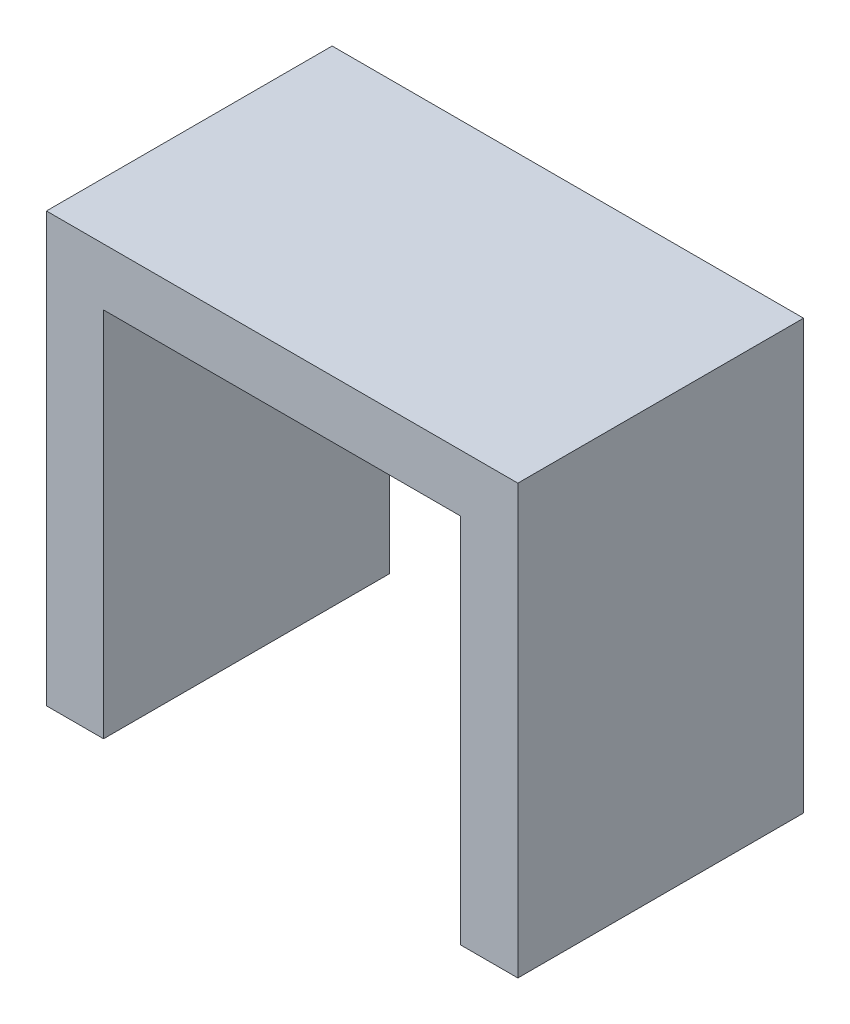
ISO-10303-21;
HEADER;
FILE_DESCRIPTION(('STEP AP214'),'2;1');
FILE_NAME('part.step','',(''),(''),'','','');
FILE_SCHEMA(('AUTOMOTIVE_DESIGN { 1 0 10303 214 1 1 1 1 }'));
ENDSEC;
DATA;
#1=APPLICATION_CONTEXT('core data for automotive mechanical design processes');
#2=APPLICATION_PROTOCOL_DEFINITION('international standard','automotive_design',2000,#1);
#3=PRODUCT_CONTEXT('',#1,'mechanical');
#4=PRODUCT('Part','Part','',(#3));
#5=PRODUCT_RELATED_PRODUCT_CATEGORY('part','',(#4));
#6=PRODUCT_DEFINITION_FORMATION('','',#4);
#7=PRODUCT_DEFINITION_CONTEXT('part definition',#1,'design');
#8=PRODUCT_DEFINITION('design','',#6,#7);
#9=PRODUCT_DEFINITION_SHAPE('','',#8);
#10=(LENGTH_UNIT() NAMED_UNIT(*) SI_UNIT(.MILLI.,.METRE.));
#11=(NAMED_UNIT(*) PLANE_ANGLE_UNIT() SI_UNIT($,.RADIAN.));
#12=(NAMED_UNIT(*) SI_UNIT($,.STERADIAN.) SOLID_ANGLE_UNIT());
#13=UNCERTAINTY_MEASURE_WITH_UNIT(LENGTH_MEASURE(1.E-05),#10,'distance_accuracy_value','');
#14=(GEOMETRIC_REPRESENTATION_CONTEXT(3) GLOBAL_UNCERTAINTY_ASSIGNED_CONTEXT((#13)) GLOBAL_UNIT_ASSIGNED_CONTEXT((#10,
#11,#12)) REPRESENTATION_CONTEXT('',''));
#15=CARTESIAN_POINT('',(0.,0.,0.));
#16=DIRECTION('',(0.,0.,1.));
#17=DIRECTION('',(1.,0.,0.));
#18=AXIS2_PLACEMENT_3D('',#15,#16,#17);
#19=CARTESIAN_POINT('',(-12.5987700818407,15.,10.));
#20=DIRECTION('',(1.,0.,0.));
#21=DIRECTION('',(0.,0.,-1.));
#22=AXIS2_PLACEMENT_3D('',#19,#20,#21);
#23=PLANE('',#22);
#24=DIRECTION('',(0.,-1.,0.));
#25=VECTOR('',#24,1.);
#26=CARTESIAN_POINT('',(-12.5987700818407,15.,0.));
#27=LINE('',#26,#25);
#28=CARTESIAN_POINT('',(-12.5987700818407,15.,0.));
#29=VERTEX_POINT('',#28);
#30=CARTESIAN_POINT('',(-12.5987700818407,0.,0.));
#31=VERTEX_POINT('',#30);
#32=EDGE_CURVE('E132',#29,#31,#27,.T.);
#33=ORIENTED_EDGE('',*,*,#32,.T.);
#34=DIRECTION('',(0.,0.,-1.));
#35=VECTOR('',#34,1.);
#36=CARTESIAN_POINT('',(-12.5987700818407,0.,10.));
#37=LINE('',#36,#35);
#38=CARTESIAN_POINT('',(-12.5987700818407,0.,10.));
#39=VERTEX_POINT('',#38);
#40=EDGE_CURVE('E11',#39,#31,#37,.T.);
#41=ORIENTED_EDGE('',*,*,#40,.F.);
#42=DIRECTION('',(0.,-1.,0.));
#43=VECTOR('',#42,1.);
#44=CARTESIAN_POINT('',(-12.5987700818407,15.,10.));
#45=LINE('',#44,#43);
#46=CARTESIAN_POINT('',(-12.5987700818407,15.,10.));
#47=VERTEX_POINT('',#46);
#48=EDGE_CURVE('E146',#47,#39,#45,.T.);
#49=ORIENTED_EDGE('',*,*,#48,.F.);
#50=DIRECTION('',(0.,0.,-1.));
#51=VECTOR('',#50,1.);
#52=CARTESIAN_POINT('',(-12.5987700818407,15.,10.));
#53=LINE('',#52,#51);
#54=EDGE_CURVE('E128',#47,#29,#53,.T.);
#55=ORIENTED_EDGE('',*,*,#54,.T.);
#56=EDGE_LOOP('',(#33,#41,#49,#55));
#57=FACE_BOUND('',#56,.T.);
#58=ADVANCED_FACE('F36',(#57),#23,.F.);
#59=CARTESIAN_POINT('',(-12.5987700818407,0.,10.));
#60=DIRECTION('',(0.,1.,0.));
#61=DIRECTION('',(0.,0.,1.));
#62=AXIS2_PLACEMENT_3D('',#59,#60,#61);
#63=PLANE('',#62);
#64=DIRECTION('',(1.,0.,0.));
#65=VECTOR('',#64,1.);
#66=CARTESIAN_POINT('',(-12.5987700818407,0.,0.));
#67=LINE('',#66,#65);
#68=CARTESIAN_POINT('',(-10.5987700818407,0.,0.));
#69=VERTEX_POINT('',#68);
#70=EDGE_CURVE('E135',#31,#69,#67,.T.);
#71=ORIENTED_EDGE('',*,*,#70,.T.);
#72=DIRECTION('',(0.,0.,-1.));
#73=VECTOR('',#72,1.);
#74=CARTESIAN_POINT('',(-10.5987700818407,0.,10.));
#75=LINE('',#74,#73);
#76=CARTESIAN_POINT('',(-10.5987700818407,0.,10.));
#77=VERTEX_POINT('',#76);
#78=EDGE_CURVE('E44',#77,#69,#75,.T.);
#79=ORIENTED_EDGE('',*,*,#78,.F.);
#80=DIRECTION('',(1.,0.,0.));
#81=VECTOR('',#80,1.);
#82=CARTESIAN_POINT('',(-12.5987700818407,0.,10.));
#83=LINE('',#82,#81);
#84=EDGE_CURVE('E95',#39,#77,#83,.T.);
#85=ORIENTED_EDGE('',*,*,#84,.F.);
#86=ORIENTED_EDGE('',*,*,#40,.T.);
#87=EDGE_LOOP('',(#71,#79,#85,#86));
#88=FACE_BOUND('',#87,.T.);
#89=ADVANCED_FACE('F181',(#88),#63,.F.);
#90=CARTESIAN_POINT('',(-10.5987700818407,0.,10.));
#91=DIRECTION('',(-1.,0.,0.));
#92=DIRECTION('',(0.,-1.,0.));
#93=AXIS2_PLACEMENT_3D('',#90,#91,#92);
#94=PLANE('',#93);
#95=DIRECTION('',(0.,1.,0.));
#96=VECTOR('',#95,1.);
#97=CARTESIAN_POINT('',(-10.5987700818407,0.,0.));
#98=LINE('',#97,#96);
#99=CARTESIAN_POINT('',(-10.5987700818407,13.,0.));
#100=VERTEX_POINT('',#99);
#101=EDGE_CURVE('E137',#69,#100,#98,.T.);
#102=ORIENTED_EDGE('',*,*,#101,.T.);
#103=DIRECTION('',(0.,0.,-1.));
#104=VECTOR('',#103,1.);
#105=CARTESIAN_POINT('',(-10.5987700818407,13.,10.));
#106=LINE('',#105,#104);
#107=CARTESIAN_POINT('',(-10.5987700818407,13.,10.));
#108=VERTEX_POINT('',#107);
#109=EDGE_CURVE('E153',#108,#100,#106,.T.);
#110=ORIENTED_EDGE('',*,*,#109,.F.);
#111=DIRECTION('',(0.,1.,0.));
#112=VECTOR('',#111,1.);
#113=CARTESIAN_POINT('',(-10.5987700818407,0.,10.));
#114=LINE('',#113,#112);
#115=EDGE_CURVE('E161',#77,#108,#114,.T.);
#116=ORIENTED_EDGE('',*,*,#115,.F.);
#117=ORIENTED_EDGE('',*,*,#78,.T.);
#118=EDGE_LOOP('',(#102,#110,#116,#117));
#119=FACE_BOUND('',#118,.T.);
#120=ADVANCED_FACE('F159',(#119),#94,.F.);
#121=CARTESIAN_POINT('',(-10.5987700818407,13.,10.));
#122=DIRECTION('',(0.,1.,0.));
#123=DIRECTION('',(0.,0.,1.));
#124=AXIS2_PLACEMENT_3D('',#121,#122,#123);
#125=PLANE('',#124);
#126=DIRECTION('',(1.,0.,0.));
#127=VECTOR('',#126,1.);
#128=CARTESIAN_POINT('',(-10.5987700818407,13.,0.));
#129=LINE('',#128,#127);
#130=CARTESIAN_POINT('',(1.9012299181593,13.,0.));
#131=VERTEX_POINT('',#130);
#132=EDGE_CURVE('E139',#100,#131,#129,.T.);
#133=ORIENTED_EDGE('',*,*,#132,.T.);
#134=DIRECTION('',(0.,0.,-1.));
#135=VECTOR('',#134,1.);
#136=CARTESIAN_POINT('',(1.9012299181593,13.,10.));
#137=LINE('',#136,#135);
#138=CARTESIAN_POINT('',(1.9012299181593,13.,10.));
#139=VERTEX_POINT('',#138);
#140=EDGE_CURVE('E150',#139,#131,#137,.T.);
#141=ORIENTED_EDGE('',*,*,#140,.F.);
#142=DIRECTION('',(1.,0.,0.));
#143=VECTOR('',#142,1.);
#144=CARTESIAN_POINT('',(-10.5987700818407,13.,10.));
#145=LINE('',#144,#143);
#146=EDGE_CURVE('E173',#108,#139,#145,.T.);
#147=ORIENTED_EDGE('',*,*,#146,.F.);
#148=ORIENTED_EDGE('',*,*,#109,.T.);
#149=EDGE_LOOP('',(#133,#141,#147,#148));
#150=FACE_BOUND('',#149,.T.);
#151=ADVANCED_FACE('F169',(#150),#125,.F.);
#152=CARTESIAN_POINT('',(1.9012299181593,13.,10.));
#153=DIRECTION('',(1.,0.,0.));
#154=DIRECTION('',(0.,1.,0.));
#155=AXIS2_PLACEMENT_3D('',#152,#153,#154);
#156=PLANE('',#155);
#157=DIRECTION('',(0.,-1.,0.));
#158=VECTOR('',#157,1.);
#159=CARTESIAN_POINT('',(1.9012299181593,13.,0.));
#160=LINE('',#159,#158);
#161=CARTESIAN_POINT('',(1.9012299181593,0.,0.));
#162=VERTEX_POINT('',#161);
#163=EDGE_CURVE('E141',#131,#162,#160,.T.);
#164=ORIENTED_EDGE('',*,*,#163,.T.);
#165=DIRECTION('',(0.,0.,-1.));
#166=VECTOR('',#165,1.);
#167=CARTESIAN_POINT('',(1.9012299181593,0.,10.));
#168=LINE('',#167,#166);
#169=CARTESIAN_POINT('',(1.9012299181593,0.,10.));
#170=VERTEX_POINT('',#169);
#171=EDGE_CURVE('E123',#170,#162,#168,.T.);
#172=ORIENTED_EDGE('',*,*,#171,.F.);
#173=DIRECTION('',(0.,-1.,0.));
#174=VECTOR('',#173,1.);
#175=CARTESIAN_POINT('',(1.9012299181593,13.,10.));
#176=LINE('',#175,#174);
#177=EDGE_CURVE('E114',#139,#170,#176,.T.);
#178=ORIENTED_EDGE('',*,*,#177,.F.);
#179=ORIENTED_EDGE('',*,*,#140,.T.);
#180=EDGE_LOOP('',(#164,#172,#178,#179));
#181=FACE_BOUND('',#180,.T.);
#182=ADVANCED_FACE('F172',(#181),#156,.F.);
#183=CARTESIAN_POINT('',(1.9012299181593,0.,10.));
#184=DIRECTION('',(0.,1.,0.));
#185=DIRECTION('',(0.,0.,1.));
#186=AXIS2_PLACEMENT_3D('',#183,#184,#185);
#187=PLANE('',#186);
#188=DIRECTION('',(1.,0.,0.));
#189=VECTOR('',#188,1.);
#190=CARTESIAN_POINT('',(1.9012299181593,0.,0.));
#191=LINE('',#190,#189);
#192=CARTESIAN_POINT('',(3.9012299181593,0.,0.));
#193=VERTEX_POINT('',#192);
#194=EDGE_CURVE('E122',#162,#193,#191,.T.);
#195=ORIENTED_EDGE('',*,*,#194,.T.);
#196=DIRECTION('',(0.,0.,-1.));
#197=VECTOR('',#196,1.);
#198=CARTESIAN_POINT('',(3.9012299181593,0.,10.));
#199=LINE('',#198,#197);
#200=CARTESIAN_POINT('',(3.9012299181593,0.,10.));
#201=VERTEX_POINT('',#200);
#202=EDGE_CURVE('E119',#201,#193,#199,.T.);
#203=ORIENTED_EDGE('',*,*,#202,.F.);
#204=DIRECTION('',(1.,0.,0.));
#205=VECTOR('',#204,1.);
#206=CARTESIAN_POINT('',(1.9012299181593,0.,10.));
#207=LINE('',#206,#205);
#208=EDGE_CURVE('E108',#170,#201,#207,.T.);
#209=ORIENTED_EDGE('',*,*,#208,.F.);
#210=ORIENTED_EDGE('',*,*,#171,.T.);
#211=EDGE_LOOP('',(#195,#203,#209,#210));
#212=FACE_BOUND('',#211,.T.);
#213=ADVANCED_FACE('F120',(#212),#187,.F.);
#214=CARTESIAN_POINT('',(3.9012299181593,0.,10.));
#215=DIRECTION('',(-1.,0.,0.));
#216=DIRECTION('',(0.,0.,1.));
#217=AXIS2_PLACEMENT_3D('',#214,#215,#216);
#218=PLANE('',#217);
#219=DIRECTION('',(0.,1.,0.));
#220=VECTOR('',#219,1.);
#221=CARTESIAN_POINT('',(3.9012299181593,0.,0.));
#222=LINE('',#221,#220);
#223=CARTESIAN_POINT('',(3.9012299181593,15.,0.));
#224=VERTEX_POINT('',#223);
#225=EDGE_CURVE('E81',#193,#224,#222,.T.);
#226=ORIENTED_EDGE('',*,*,#225,.T.);
#227=DIRECTION('',(0.,0.,-1.));
#228=VECTOR('',#227,1.);
#229=CARTESIAN_POINT('',(3.9012299181593,15.,10.));
#230=LINE('',#229,#228);
#231=CARTESIAN_POINT('',(3.9012299181593,15.,10.));
#232=VERTEX_POINT('',#231);
#233=EDGE_CURVE('E124',#232,#224,#230,.T.);
#234=ORIENTED_EDGE('',*,*,#233,.F.);
#235=DIRECTION('',(0.,1.,0.));
#236=VECTOR('',#235,1.);
#237=CARTESIAN_POINT('',(3.9012299181593,0.,10.));
#238=LINE('',#237,#236);
#239=EDGE_CURVE('E112',#201,#232,#238,.T.);
#240=ORIENTED_EDGE('',*,*,#239,.F.);
#241=ORIENTED_EDGE('',*,*,#202,.T.);
#242=EDGE_LOOP('',(#226,#234,#240,#241));
#243=FACE_BOUND('',#242,.T.);
#244=ADVANCED_FACE('F126',(#243),#218,.F.);
#245=CARTESIAN_POINT('',(3.9012299181593,15.,10.));
#246=DIRECTION('',(0.,-1.,0.));
#247=DIRECTION('',(1.,0.,0.));
#248=AXIS2_PLACEMENT_3D('',#245,#246,#247);
#249=PLANE('',#248);
#250=DIRECTION('',(-1.,0.,0.));
#251=VECTOR('',#250,1.);
#252=CARTESIAN_POINT('',(3.9012299181593,15.,0.));
#253=LINE('',#252,#251);
#254=EDGE_CURVE('E87',#224,#29,#253,.T.);
#255=ORIENTED_EDGE('',*,*,#254,.T.);
#256=ORIENTED_EDGE('',*,*,#54,.F.);
#257=DIRECTION('',(-1.,0.,0.));
#258=VECTOR('',#257,1.);
#259=CARTESIAN_POINT('',(3.9012299181593,15.,10.));
#260=LINE('',#259,#258);
#261=EDGE_CURVE('E52',#232,#47,#260,.T.);
#262=ORIENTED_EDGE('',*,*,#261,.F.);
#263=ORIENTED_EDGE('',*,*,#233,.T.);
#264=EDGE_LOOP('',(#255,#256,#262,#263));
#265=FACE_BOUND('',#264,.T.);
#266=ADVANCED_FACE('F197',(#265),#249,.F.);
#267=CARTESIAN_POINT('',(0.,0.,10.));
#268=DIRECTION('',(0.,0.,1.));
#269=DIRECTION('',(1.,0.,0.));
#270=AXIS2_PLACEMENT_3D('',#267,#268,#269);
#271=PLANE('',#270);
#272=ORIENTED_EDGE('',*,*,#48,.T.);
#273=ORIENTED_EDGE('',*,*,#84,.T.);
#274=ORIENTED_EDGE('',*,*,#115,.T.);
#275=ORIENTED_EDGE('',*,*,#146,.T.);
#276=ORIENTED_EDGE('',*,*,#177,.T.);
#277=ORIENTED_EDGE('',*,*,#208,.T.);
#278=ORIENTED_EDGE('',*,*,#239,.T.);
#279=ORIENTED_EDGE('',*,*,#261,.T.);
#280=EDGE_LOOP('',(#272,#273,#274,#275,#276,#277,#278,#279));
#281=FACE_BOUND('',#280,.T.);
#282=ADVANCED_FACE('F110',(#281),#271,.T.);
#283=CARTESIAN_POINT('',(0.,0.,0.));
#284=DIRECTION('',(0.,0.,1.));
#285=DIRECTION('',(1.,0.,0.));
#286=AXIS2_PLACEMENT_3D('',#283,#284,#285);
#287=PLANE('',#286);
#288=ORIENTED_EDGE('',*,*,#32,.F.);
#289=ORIENTED_EDGE('',*,*,#254,.F.);
#290=ORIENTED_EDGE('',*,*,#225,.F.);
#291=ORIENTED_EDGE('',*,*,#194,.F.);
#292=ORIENTED_EDGE('',*,*,#163,.F.);
#293=ORIENTED_EDGE('',*,*,#132,.F.);
#294=ORIENTED_EDGE('',*,*,#101,.F.);
#295=ORIENTED_EDGE('',*,*,#70,.F.);
#296=EDGE_LOOP('',(#288,#289,#290,#291,#292,#293,#294,#295));
#297=FACE_BOUND('',#296,.T.);
#298=ADVANCED_FACE('F165',(#297),#287,.F.);
#299=CLOSED_SHELL('',(#58,#89,#120,#151,#182,#213,#244,#266,#282,#298));
#300=MANIFOLD_SOLID_BREP('B2',#299);
#301=ADVANCED_BREP_SHAPE_REPRESENTATION('',(#18,#300),#14);
#302=SHAPE_DEFINITION_REPRESENTATION(#9,#301);
ENDSEC;
END-ISO-10303-21;
